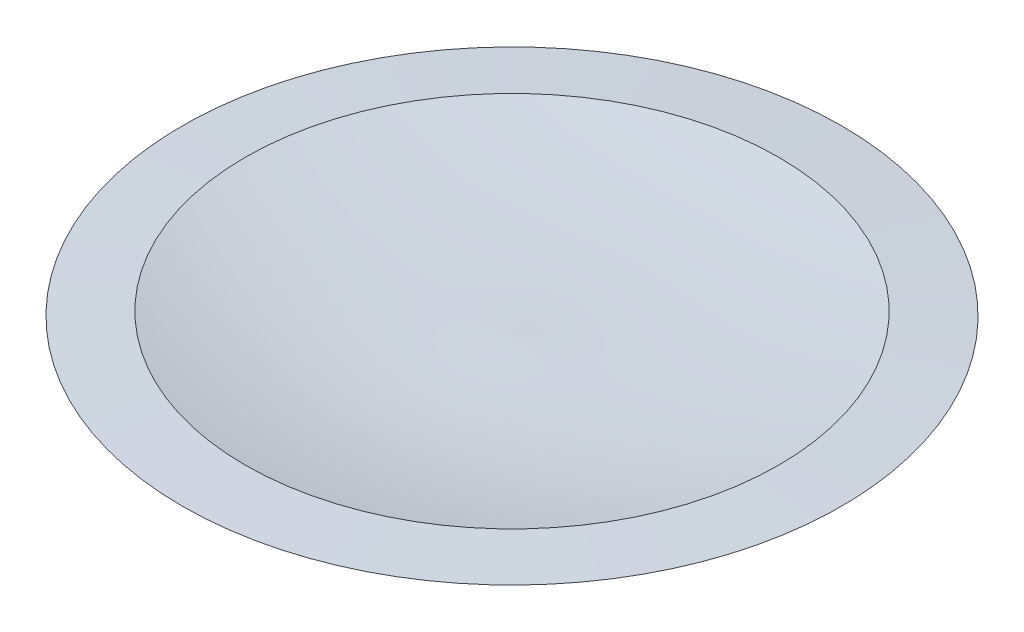
ISO-10303-21;
HEADER;
FILE_DESCRIPTION(('STEP AP214'),'2;1');
FILE_NAME('part.step','',(''),(''),'','','');
FILE_SCHEMA(('AUTOMOTIVE_DESIGN { 1 0 10303 214 1 1 1 1 }'));
ENDSEC;
DATA;
#1=APPLICATION_CONTEXT('core data for automotive mechanical design processes');
#2=APPLICATION_PROTOCOL_DEFINITION('international standard','automotive_design',2000,#1);
#3=PRODUCT_CONTEXT('',#1,'mechanical');
#4=PRODUCT('Part','Part','',(#3));
#5=PRODUCT_RELATED_PRODUCT_CATEGORY('part','',(#4));
#6=PRODUCT_DEFINITION_FORMATION('','',#4);
#7=PRODUCT_DEFINITION_CONTEXT('part definition',#1,'design');
#8=PRODUCT_DEFINITION('design','',#6,#7);
#9=PRODUCT_DEFINITION_SHAPE('','',#8);
#10=(LENGTH_UNIT() NAMED_UNIT(*) SI_UNIT(.MILLI.,.METRE.));
#11=(NAMED_UNIT(*) PLANE_ANGLE_UNIT() SI_UNIT($,.RADIAN.));
#12=(NAMED_UNIT(*) SI_UNIT($,.STERADIAN.) SOLID_ANGLE_UNIT());
#13=UNCERTAINTY_MEASURE_WITH_UNIT(LENGTH_MEASURE(1.E-05),#10,'distance_accuracy_value','');
#14=(GEOMETRIC_REPRESENTATION_CONTEXT(3) GLOBAL_UNCERTAINTY_ASSIGNED_CONTEXT((#13)) GLOBAL_UNIT_ASSIGNED_CONTEXT((#10,
#11,#12)) REPRESENTATION_CONTEXT('',''));
#15=CARTESIAN_POINT('',(0.,0.,0.));
#16=DIRECTION('',(0.,0.,1.));
#17=DIRECTION('',(1.,0.,0.));
#18=AXIS2_PLACEMENT_3D('',#15,#16,#17);
#19=CARTESIAN_POINT('',(0.,0.,0.));
#20=DIRECTION('',(0.,-1.,0.));
#21=DIRECTION('',(0.,0.,-1.));
#22=AXIS2_PLACEMENT_3D('',#19,#20,#21);
#23=PLANE('',#22);
#24=CARTESIAN_POINT('',(0.,0.,0.));
#25=DIRECTION('',(0.,-1.,0.));
#26=DIRECTION('',(0.,0.,-1.));
#27=AXIS2_PLACEMENT_3D('',#24,#25,#26);
#28=CIRCLE('',#27,45.2166436967347);
#29=CARTESIAN_POINT('',(0.,0.,-45.2166436967347));
#30=VERTEX_POINT('',#29);
#31=EDGE_CURVE('E58',#30,#30,#28,.T.);
#32=ORIENTED_EDGE('',*,*,#31,.T.);
#33=EDGE_LOOP('',(#32));
#34=FACE_BOUND('',#33,.T.);
#35=ADVANCED_FACE('F34',(#34),#23,.T.);
#36=CARTESIAN_POINT('',(102.774347297631,18.7382695597881,0.));
#37=CARTESIAN_POINT('',(52.4464106947826,7.20430903362217,0.));
#38=CARTESIAN_POINT('',(0.,10.4559029697175,0.));
#39=B_SPLINE_CURVE_WITH_KNOTS('',2,(#36,#37,#38),.UNSPECIFIED.,.F.,.F.,(3,3),(0.,1.),.UNSPECIFIED.);
#40=CARTESIAN_POINT('',(0.,0.,0.));
#41=DIRECTION('',(0.,-1.,0.));
#42=AXIS1_PLACEMENT('',#40,#41);
#43=SURFACE_OF_REVOLUTION('',#39,#42);
#44=CARTESIAN_POINT('',(0.,10.4559029697175,0.));
#45=VERTEX_POINT('',#44);
#46=VERTEX_LOOP('',#45);
#47=FACE_BOUND('',#46,.T.);
#48=CARTESIAN_POINT('',(0.,18.7382695597881,0.));
#49=DIRECTION('',(0.,-1.,0.));
#50=DIRECTION('',(0.,0.,-1.));
#51=AXIS2_PLACEMENT_3D('',#48,#49,#50);
#52=CIRCLE('',#51,102.774347297631);
#53=CARTESIAN_POINT('',(0.,18.7382695597881,-102.774347297631));
#54=VERTEX_POINT('',#53);
#55=EDGE_CURVE('E11',#54,#54,#52,.T.);
#56=ORIENTED_EDGE('',*,*,#55,.F.);
#57=EDGE_LOOP('',(#56));
#58=FACE_BOUND('',#57,.T.);
#59=ADVANCED_FACE('F43',(#47,#58),#43,.F.);
#60=CARTESIAN_POINT('',(0.,17.1332416451733,0.));
#61=DIRECTION('',(0.,-1.,0.));
#62=DIRECTION('',(0.,0.,-1.));
#63=AXIS2_PLACEMENT_3D('',#60,#61,#62);
#64=CONICAL_SURFACE('',#63,127.,1.50463977443142);
#65=ORIENTED_EDGE('',*,*,#55,.T.);
#66=EDGE_LOOP('',(#65));
#67=FACE_BOUND('',#66,.T.);
#68=CARTESIAN_POINT('',(0.,17.1332416451733,0.));
#69=DIRECTION('',(0.,-1.,0.));
#70=DIRECTION('',(0.,0.,-1.));
#71=AXIS2_PLACEMENT_3D('',#68,#69,#70);
#72=CIRCLE('',#71,127.);
#73=CARTESIAN_POINT('',(0.,17.1332416451733,-127.));
#74=VERTEX_POINT('',#73);
#75=EDGE_CURVE('E40',#74,#74,#72,.T.);
#76=ORIENTED_EDGE('',*,*,#75,.F.);
#77=EDGE_LOOP('',(#76));
#78=FACE_BOUND('',#77,.T.);
#79=ADVANCED_FACE('F46',(#67,#78),#64,.T.);
#80=CARTESIAN_POINT('',(49.1056186790977,3.88897498236301,0.));
#81=CARTESIAN_POINT('',(89.5035011245616,4.33566250854728,0.));
#82=CARTESIAN_POINT('',(127.,17.1332416451733,0.));
#83=B_SPLINE_CURVE_WITH_KNOTS('',2,(#80,#81,#82),.UNSPECIFIED.,.F.,.F.,(3,3),(0.,1.),.UNSPECIFIED.);
#84=CARTESIAN_POINT('',(0.,0.,0.));
#85=DIRECTION('',(0.,-1.,0.));
#86=AXIS1_PLACEMENT('',#84,#85);
#87=SURFACE_OF_REVOLUTION('',#83,#86);
#88=ORIENTED_EDGE('',*,*,#75,.T.);
#89=EDGE_LOOP('',(#88));
#90=FACE_BOUND('',#89,.T.);
#91=CARTESIAN_POINT('',(0.,3.88897498236301,0.));
#92=DIRECTION('',(0.,-1.,0.));
#93=DIRECTION('',(0.,0.,-1.));
#94=AXIS2_PLACEMENT_3D('',#91,#92,#93);
#95=CIRCLE('',#94,49.1056186790977);
#96=CARTESIAN_POINT('',(0.,3.88897498236301,-49.1056186790977));
#97=VERTEX_POINT('',#96);
#98=EDGE_CURVE('E56',#97,#97,#95,.T.);
#99=ORIENTED_EDGE('',*,*,#98,.F.);
#100=EDGE_LOOP('',(#99));
#101=FACE_BOUND('',#100,.T.);
#102=ADVANCED_FACE('F51',(#90,#101),#87,.F.);
#103=CARTESIAN_POINT('',(0.,0.,0.));
#104=DIRECTION('',(0.,1.,0.));
#105=DIRECTION('',(0.,0.,1.));
#106=AXIS2_PLACEMENT_3D('',#103,#104,#105);
#107=CONICAL_SURFACE('',#106,45.2166436967347,0.785398163397446);
#108=ORIENTED_EDGE('',*,*,#98,.T.);
#109=EDGE_LOOP('',(#108));
#110=FACE_BOUND('',#109,.T.);
#111=ORIENTED_EDGE('',*,*,#31,.F.);
#112=EDGE_LOOP('',(#111));
#113=FACE_BOUND('',#112,.T.);
#114=ADVANCED_FACE('F76',(#110,#113),#107,.T.);
#115=CLOSED_SHELL('',(#35,#59,#79,#102,#114));
#116=MANIFOLD_SOLID_BREP('B2',#115);
#117=ADVANCED_BREP_SHAPE_REPRESENTATION('',(#18,#116),#14);
#118=SHAPE_DEFINITION_REPRESENTATION(#9,#117);
ENDSEC;
END-ISO-10303-21;
